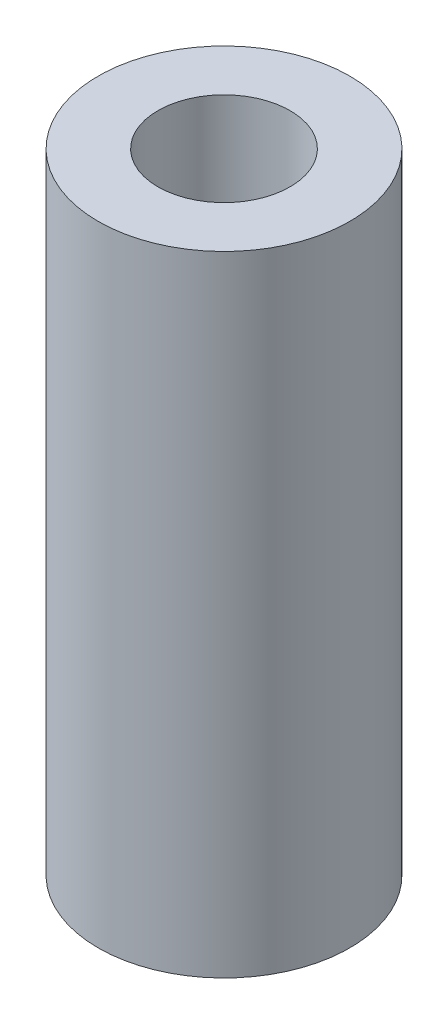
ISO-10303-21;
HEADER;
FILE_DESCRIPTION(('STEP AP214'),'2;1');
FILE_NAME('part.step','',(''),(''),'','','');
FILE_SCHEMA(('AUTOMOTIVE_DESIGN { 1 0 10303 214 1 1 1 1 }'));
ENDSEC;
DATA;
#1=APPLICATION_CONTEXT('core data for automotive mechanical design processes');
#2=APPLICATION_PROTOCOL_DEFINITION('international standard','automotive_design',2000,#1);
#3=PRODUCT_CONTEXT('',#1,'mechanical');
#4=PRODUCT('Part','Part','',(#3));
#5=PRODUCT_RELATED_PRODUCT_CATEGORY('part','',(#4));
#6=PRODUCT_DEFINITION_FORMATION('','',#4);
#7=PRODUCT_DEFINITION_CONTEXT('part definition',#1,'design');
#8=PRODUCT_DEFINITION('design','',#6,#7);
#9=PRODUCT_DEFINITION_SHAPE('','',#8);
#10=(LENGTH_UNIT() NAMED_UNIT(*) SI_UNIT(.MILLI.,.METRE.));
#11=(NAMED_UNIT(*) PLANE_ANGLE_UNIT() SI_UNIT($,.RADIAN.));
#12=(NAMED_UNIT(*) SI_UNIT($,.STERADIAN.) SOLID_ANGLE_UNIT());
#13=UNCERTAINTY_MEASURE_WITH_UNIT(LENGTH_MEASURE(1.E-05),#10,'distance_accuracy_value','');
#14=(GEOMETRIC_REPRESENTATION_CONTEXT(3) GLOBAL_UNCERTAINTY_ASSIGNED_CONTEXT((#13)) GLOBAL_UNIT_ASSIGNED_CONTEXT((#10,
#11,#12)) REPRESENTATION_CONTEXT('',''));
#15=CARTESIAN_POINT('',(0.,0.,0.));
#16=DIRECTION('',(0.,0.,1.));
#17=DIRECTION('',(1.,0.,0.));
#18=AXIS2_PLACEMENT_3D('',#15,#16,#17);
#19=CARTESIAN_POINT('',(0.,20.,0.));
#20=DIRECTION('',(0.,1.,0.));
#21=DIRECTION('',(0.,0.,1.));
#22=AXIS2_PLACEMENT_3D('',#19,#20,#21);
#23=PLANE('',#22);
#24=CARTESIAN_POINT('',(0.,20.,0.));
#25=DIRECTION('',(0.,1.,0.));
#26=DIRECTION('',(0.,0.,1.));
#27=AXIS2_PLACEMENT_3D('',#24,#25,#26);
#28=CIRCLE('',#27,4.);
#29=CARTESIAN_POINT('',(0.,20.,4.));
#30=VERTEX_POINT('',#29);
#31=EDGE_CURVE('E10',#30,#30,#28,.T.);
#32=ORIENTED_EDGE('',*,*,#31,.T.);
#33=EDGE_LOOP('',(#32));
#34=FACE_BOUND('',#33,.T.);
#35=CARTESIAN_POINT('',(0.,20.,0.));
#36=DIRECTION('',(0.,1.,0.));
#37=DIRECTION('',(0.,0.,1.));
#38=AXIS2_PLACEMENT_3D('',#35,#36,#37);
#39=CIRCLE('',#38,2.1);
#40=CARTESIAN_POINT('',(0.,20.,2.1));
#41=VERTEX_POINT('',#40);
#42=EDGE_CURVE('E54',#41,#41,#39,.T.);
#43=ORIENTED_EDGE('',*,*,#42,.F.);
#44=EDGE_LOOP('',(#43));
#45=FACE_BOUND('',#44,.T.);
#46=ADVANCED_FACE('F41',(#34,#45),#23,.T.);
#47=CARTESIAN_POINT('',(0.,0.,0.));
#48=DIRECTION('',(0.,1.,0.));
#49=DIRECTION('',(0.,0.,1.));
#50=AXIS2_PLACEMENT_3D('',#47,#48,#49);
#51=PLANE('',#50);
#52=CARTESIAN_POINT('',(0.,0.,0.));
#53=DIRECTION('',(0.,1.,0.));
#54=DIRECTION('',(0.,0.,1.));
#55=AXIS2_PLACEMENT_3D('',#52,#53,#54);
#56=CIRCLE('',#55,4.);
#57=CARTESIAN_POINT('',(0.,0.,4.));
#58=VERTEX_POINT('',#57);
#59=EDGE_CURVE('E45',#58,#58,#56,.T.);
#60=ORIENTED_EDGE('',*,*,#59,.F.);
#61=EDGE_LOOP('',(#60));
#62=FACE_BOUND('',#61,.T.);
#63=CARTESIAN_POINT('',(0.,0.,0.));
#64=DIRECTION('',(0.,1.,0.));
#65=DIRECTION('',(0.,0.,1.));
#66=AXIS2_PLACEMENT_3D('',#63,#64,#65);
#67=CIRCLE('',#66,2.1);
#68=CARTESIAN_POINT('',(0.,0.,2.1));
#69=VERTEX_POINT('',#68);
#70=EDGE_CURVE('E56',#69,#69,#67,.T.);
#71=ORIENTED_EDGE('',*,*,#70,.T.);
#72=EDGE_LOOP('',(#71));
#73=FACE_BOUND('',#72,.T.);
#74=ADVANCED_FACE('F68',(#62,#73),#51,.F.);
#75=CARTESIAN_POINT('',(0.,20.,0.));
#76=DIRECTION('',(0.,-1.,0.));
#77=DIRECTION('',(0.,0.,-1.));
#78=AXIS2_PLACEMENT_3D('',#75,#76,#77);
#79=CYLINDRICAL_SURFACE('',#78,4.);
#80=ORIENTED_EDGE('',*,*,#31,.F.);
#81=EDGE_LOOP('',(#80));
#82=FACE_BOUND('',#81,.T.);
#83=ORIENTED_EDGE('',*,*,#59,.T.);
#84=EDGE_LOOP('',(#83));
#85=FACE_BOUND('',#84,.T.);
#86=ADVANCED_FACE('F43',(#82,#85),#79,.T.);
#87=CARTESIAN_POINT('',(0.,20.,0.));
#88=DIRECTION('',(0.,-1.,0.));
#89=DIRECTION('',(0.,0.,-1.));
#90=AXIS2_PLACEMENT_3D('',#87,#88,#89);
#91=CYLINDRICAL_SURFACE('',#90,2.1);
#92=ORIENTED_EDGE('',*,*,#42,.T.);
#93=EDGE_LOOP('',(#92));
#94=FACE_BOUND('',#93,.T.);
#95=ORIENTED_EDGE('',*,*,#70,.F.);
#96=EDGE_LOOP('',(#95));
#97=FACE_BOUND('',#96,.T.);
#98=ADVANCED_FACE('F64',(#94,#97),#91,.F.);
#99=CLOSED_SHELL('',(#46,#74,#86,#98));
#100=MANIFOLD_SOLID_BREP('B2',#99);
#101=ADVANCED_BREP_SHAPE_REPRESENTATION('',(#18,#100),#14);
#102=SHAPE_DEFINITION_REPRESENTATION(#9,#101);
ENDSEC;
END-ISO-10303-21;
